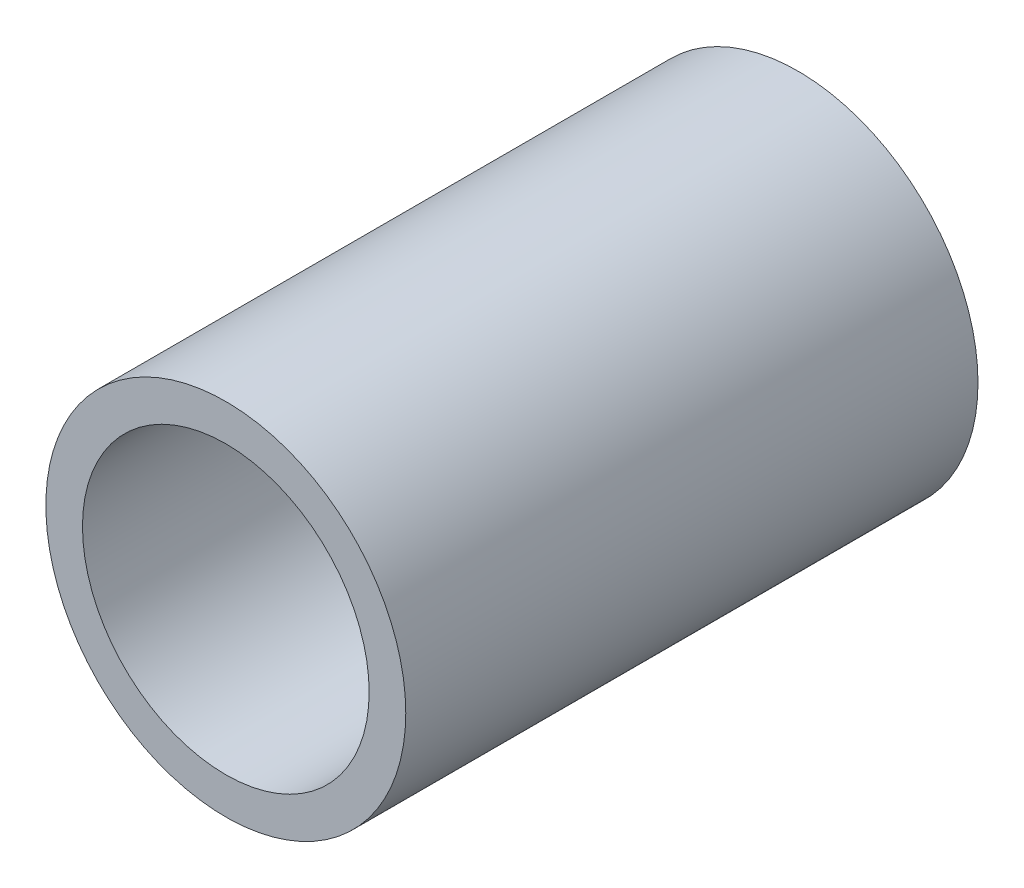
ISO-10303-21;
HEADER;
FILE_DESCRIPTION(('STEP AP214'),'2;1');
FILE_NAME('part.step','',(''),(''),'','','');
FILE_SCHEMA(('AUTOMOTIVE_DESIGN { 1 0 10303 214 1 1 1 1 }'));
ENDSEC;
DATA;
#1=APPLICATION_CONTEXT('core data for automotive mechanical design processes');
#2=APPLICATION_PROTOCOL_DEFINITION('international standard','automotive_design',2000,#1);
#3=PRODUCT_CONTEXT('',#1,'mechanical');
#4=PRODUCT('Part','Part','',(#3));
#5=PRODUCT_RELATED_PRODUCT_CATEGORY('part','',(#4));
#6=PRODUCT_DEFINITION_FORMATION('','',#4);
#7=PRODUCT_DEFINITION_CONTEXT('part definition',#1,'design');
#8=PRODUCT_DEFINITION('design','',#6,#7);
#9=PRODUCT_DEFINITION_SHAPE('','',#8);
#10=(LENGTH_UNIT() NAMED_UNIT(*) SI_UNIT(.MILLI.,.METRE.));
#11=(NAMED_UNIT(*) PLANE_ANGLE_UNIT() SI_UNIT($,.RADIAN.));
#12=(NAMED_UNIT(*) SI_UNIT($,.STERADIAN.) SOLID_ANGLE_UNIT());
#13=UNCERTAINTY_MEASURE_WITH_UNIT(LENGTH_MEASURE(1.E-05),#10,'distance_accuracy_value','');
#14=(GEOMETRIC_REPRESENTATION_CONTEXT(3) GLOBAL_UNCERTAINTY_ASSIGNED_CONTEXT((#13)) GLOBAL_UNIT_ASSIGNED_CONTEXT((#10,
#11,#12)) REPRESENTATION_CONTEXT('',''));
#15=CARTESIAN_POINT('',(0.,0.,0.));
#16=DIRECTION('',(0.,0.,1.));
#17=DIRECTION('',(1.,0.,0.));
#18=AXIS2_PLACEMENT_3D('',#15,#16,#17);
#19=CARTESIAN_POINT('',(0.,0.,6.35));
#20=DIRECTION('',(0.,0.,1.));
#21=DIRECTION('',(1.,0.,0.));
#22=AXIS2_PLACEMENT_3D('',#19,#20,#21);
#23=PLANE('',#22);
#24=CARTESIAN_POINT('',(0.,0.,6.35));
#25=DIRECTION('',(0.,0.,1.));
#26=DIRECTION('',(1.,0.,0.));
#27=AXIS2_PLACEMENT_3D('',#24,#25,#26);
#28=CIRCLE('',#27,3.99415);
#29=CARTESIAN_POINT('',(3.99415,0.,6.35));
#30=VERTEX_POINT('',#29);
#31=EDGE_CURVE('E10',#30,#30,#28,.T.);
#32=ORIENTED_EDGE('',*,*,#31,.T.);
#33=EDGE_LOOP('',(#32));
#34=FACE_BOUND('',#33,.T.);
#35=CARTESIAN_POINT('',(0.,0.,6.35));
#36=DIRECTION('',(0.,0.,1.));
#37=DIRECTION('',(1.,0.,0.));
#38=AXIS2_PLACEMENT_3D('',#35,#36,#37);
#39=CIRCLE('',#38,3.18135);
#40=CARTESIAN_POINT('',(3.18135,0.,6.35));
#41=VERTEX_POINT('',#40);
#42=EDGE_CURVE('E50',#41,#41,#39,.T.);
#43=ORIENTED_EDGE('',*,*,#42,.F.);
#44=EDGE_LOOP('',(#43));
#45=FACE_BOUND('',#44,.T.);
#46=ADVANCED_FACE('F39',(#34,#45),#23,.T.);
#47=CARTESIAN_POINT('',(0.,0.,6.35));
#48=DIRECTION('',(0.,0.,-1.));
#49=DIRECTION('',(-1.,0.,0.));
#50=AXIS2_PLACEMENT_3D('',#47,#48,#49);
#51=CYLINDRICAL_SURFACE('',#50,3.99415);
#52=ORIENTED_EDGE('',*,*,#31,.F.);
#53=EDGE_LOOP('',(#52));
#54=FACE_BOUND('',#53,.T.);
#55=CARTESIAN_POINT('',(0.,0.,-6.35));
#56=DIRECTION('',(0.,0.,1.));
#57=DIRECTION('',(1.,0.,0.));
#58=AXIS2_PLACEMENT_3D('',#55,#56,#57);
#59=CIRCLE('',#58,3.99415);
#60=CARTESIAN_POINT('',(3.99415,0.,-6.35));
#61=VERTEX_POINT('',#60);
#62=EDGE_CURVE('E52',#61,#61,#59,.T.);
#63=ORIENTED_EDGE('',*,*,#62,.T.);
#64=EDGE_LOOP('',(#63));
#65=FACE_BOUND('',#64,.T.);
#66=ADVANCED_FACE('F41',(#54,#65),#51,.T.);
#67=CARTESIAN_POINT('',(0.,0.,6.35));
#68=DIRECTION('',(0.,0.,-1.));
#69=DIRECTION('',(-1.,0.,0.));
#70=AXIS2_PLACEMENT_3D('',#67,#68,#69);
#71=CYLINDRICAL_SURFACE('',#70,3.18135);
#72=ORIENTED_EDGE('',*,*,#42,.T.);
#73=EDGE_LOOP('',(#72));
#74=FACE_BOUND('',#73,.T.);
#75=CARTESIAN_POINT('',(0.,0.,-6.35));
#76=DIRECTION('',(0.,0.,1.));
#77=DIRECTION('',(1.,0.,0.));
#78=AXIS2_PLACEMENT_3D('',#75,#76,#77);
#79=CIRCLE('',#78,3.18135);
#80=CARTESIAN_POINT('',(3.18135,0.,-6.35));
#81=VERTEX_POINT('',#80);
#82=EDGE_CURVE('E56',#81,#81,#79,.T.);
#83=ORIENTED_EDGE('',*,*,#82,.F.);
#84=EDGE_LOOP('',(#83));
#85=FACE_BOUND('',#84,.T.);
#86=ADVANCED_FACE('F68',(#74,#85),#71,.F.);
#87=CARTESIAN_POINT('',(0.,0.,-6.35));
#88=DIRECTION('',(0.,0.,1.));
#89=DIRECTION('',(1.,0.,0.));
#90=AXIS2_PLACEMENT_3D('',#87,#88,#89);
#91=PLANE('',#90);
#92=ORIENTED_EDGE('',*,*,#82,.T.);
#93=EDGE_LOOP('',(#92));
#94=FACE_BOUND('',#93,.T.);
#95=ORIENTED_EDGE('',*,*,#62,.F.);
#96=EDGE_LOOP('',(#95));
#97=FACE_BOUND('',#96,.T.);
#98=ADVANCED_FACE('F70',(#94,#97),#91,.F.);
#99=CLOSED_SHELL('',(#46,#66,#86,#98));
#100=MANIFOLD_SOLID_BREP('B2',#99);
#101=ADVANCED_BREP_SHAPE_REPRESENTATION('',(#18,#100),#14);
#102=SHAPE_DEFINITION_REPRESENTATION(#9,#101);
ENDSEC;
END-ISO-10303-21;
